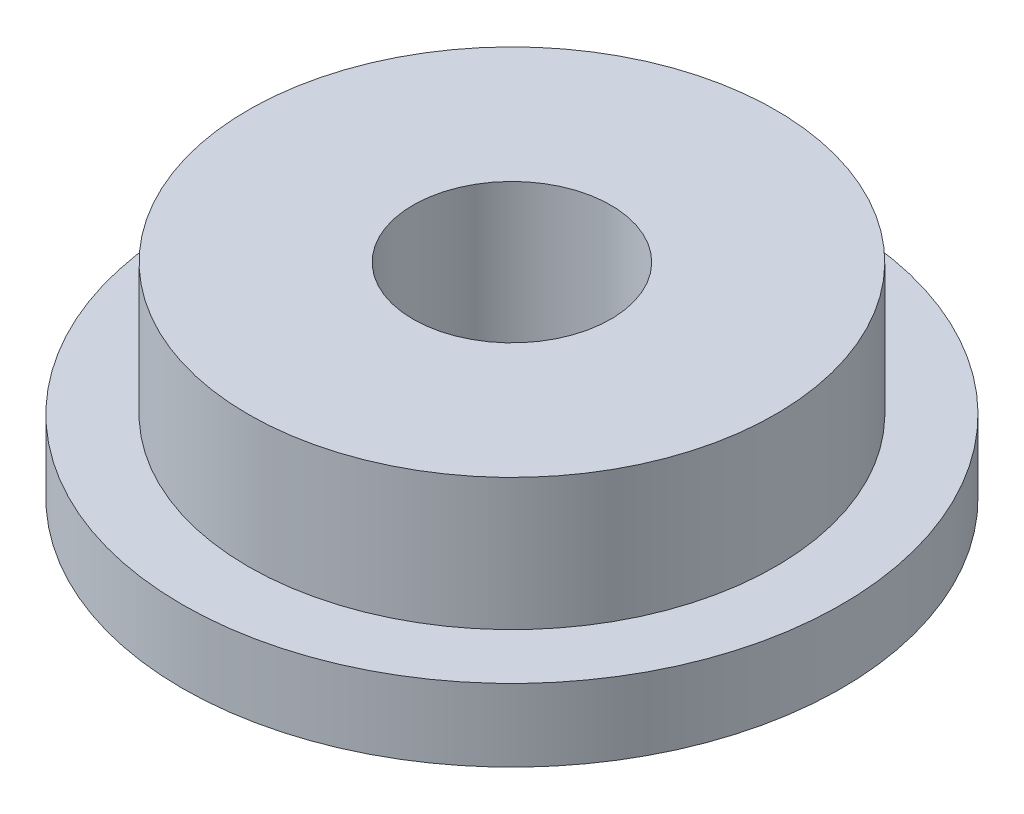
ISO-10303-21;
HEADER;
FILE_DESCRIPTION(('STEP AP214'),'2;1');
FILE_NAME('part.step','',(''),(''),'','','');
FILE_SCHEMA(('AUTOMOTIVE_DESIGN { 1 0 10303 214 1 1 1 1 }'));
ENDSEC;
DATA;
#1=APPLICATION_CONTEXT('core data for automotive mechanical design processes');
#2=APPLICATION_PROTOCOL_DEFINITION('international standard','automotive_design',2000,#1);
#3=PRODUCT_CONTEXT('',#1,'mechanical');
#4=PRODUCT('Part','Part','',(#3));
#5=PRODUCT_RELATED_PRODUCT_CATEGORY('part','',(#4));
#6=PRODUCT_DEFINITION_FORMATION('','',#4);
#7=PRODUCT_DEFINITION_CONTEXT('part definition',#1,'design');
#8=PRODUCT_DEFINITION('design','',#6,#7);
#9=PRODUCT_DEFINITION_SHAPE('','',#8);
#10=(LENGTH_UNIT() NAMED_UNIT(*) SI_UNIT(.MILLI.,.METRE.));
#11=(NAMED_UNIT(*) PLANE_ANGLE_UNIT() SI_UNIT($,.RADIAN.));
#12=(NAMED_UNIT(*) SI_UNIT($,.STERADIAN.) SOLID_ANGLE_UNIT());
#13=UNCERTAINTY_MEASURE_WITH_UNIT(LENGTH_MEASURE(1.E-05),#10,'distance_accuracy_value','');
#14=(GEOMETRIC_REPRESENTATION_CONTEXT(3) GLOBAL_UNCERTAINTY_ASSIGNED_CONTEXT((#13)) GLOBAL_UNIT_ASSIGNED_CONTEXT((#10,
#11,#12)) REPRESENTATION_CONTEXT('',''));
#15=CARTESIAN_POINT('',(0.,0.,0.));
#16=DIRECTION('',(0.,0.,1.));
#17=DIRECTION('',(1.,0.,0.));
#18=AXIS2_PLACEMENT_3D('',#15,#16,#17);
#19=CARTESIAN_POINT('',(0.,1.1,0.));
#20=DIRECTION('',(0.,-1.,0.));
#21=DIRECTION('',(0.,0.,-1.));
#22=AXIS2_PLACEMENT_3D('',#19,#20,#21);
#23=CYLINDRICAL_SURFACE('',#22,5.);
#24=CARTESIAN_POINT('',(0.,1.1,0.));
#25=DIRECTION('',(0.,1.,0.));
#26=DIRECTION('',(0.,0.,1.));
#27=AXIS2_PLACEMENT_3D('',#24,#25,#26);
#28=CIRCLE('',#27,5.);
#29=CARTESIAN_POINT('',(0.,1.1,5.));
#30=VERTEX_POINT('',#29);
#31=EDGE_CURVE('E45',#30,#30,#28,.T.);
#32=ORIENTED_EDGE('',*,*,#31,.F.);
#33=EDGE_LOOP('',(#32));
#34=FACE_BOUND('',#33,.T.);
#35=CARTESIAN_POINT('',(0.,0.,0.));
#36=DIRECTION('',(0.,1.,0.));
#37=DIRECTION('',(0.,0.,1.));
#38=AXIS2_PLACEMENT_3D('',#35,#36,#37);
#39=CIRCLE('',#38,5.);
#40=CARTESIAN_POINT('',(0.,0.,5.));
#41=VERTEX_POINT('',#40);
#42=EDGE_CURVE('E40',#41,#41,#39,.T.);
#43=ORIENTED_EDGE('',*,*,#42,.T.);
#44=EDGE_LOOP('',(#43));
#45=FACE_BOUND('',#44,.T.);
#46=ADVANCED_FACE('F37',(#34,#45),#23,.T.);
#47=CARTESIAN_POINT('',(0.,1.1,0.));
#48=DIRECTION('',(0.,1.,0.));
#49=DIRECTION('',(0.,0.,1.));
#50=AXIS2_PLACEMENT_3D('',#47,#48,#49);
#51=PLANE('',#50);
#52=CARTESIAN_POINT('',(0.,1.1,0.));
#53=DIRECTION('',(0.,1.,0.));
#54=DIRECTION('',(0.,0.,1.));
#55=AXIS2_PLACEMENT_3D('',#52,#53,#54);
#56=CIRCLE('',#55,4.);
#57=CARTESIAN_POINT('',(0.,1.1,4.));
#58=VERTEX_POINT('',#57);
#59=EDGE_CURVE('E10',#58,#58,#56,.T.);
#60=ORIENTED_EDGE('',*,*,#59,.F.);
#61=EDGE_LOOP('',(#60));
#62=FACE_BOUND('',#61,.T.);
#63=ORIENTED_EDGE('',*,*,#31,.T.);
#64=EDGE_LOOP('',(#63));
#65=FACE_BOUND('',#64,.T.);
#66=ADVANCED_FACE('F86',(#62,#65),#51,.T.);
#67=CARTESIAN_POINT('',(0.,0.,0.));
#68=DIRECTION('',(0.,1.,0.));
#69=DIRECTION('',(0.,0.,1.));
#70=AXIS2_PLACEMENT_3D('',#67,#68,#69);
#71=PLANE('',#70);
#72=CARTESIAN_POINT('',(0.,0.,0.));
#73=DIRECTION('',(0.,1.,0.));
#74=DIRECTION('',(0.,0.,1.));
#75=AXIS2_PLACEMENT_3D('',#72,#73,#74);
#76=CIRCLE('',#75,1.5);
#77=CARTESIAN_POINT('',(0.,0.,1.5));
#78=VERTEX_POINT('',#77);
#79=EDGE_CURVE('E56',#78,#78,#76,.T.);
#80=ORIENTED_EDGE('',*,*,#79,.T.);
#81=EDGE_LOOP('',(#80));
#82=FACE_BOUND('',#81,.T.);
#83=ORIENTED_EDGE('',*,*,#42,.F.);
#84=EDGE_LOOP('',(#83));
#85=FACE_BOUND('',#84,.T.);
#86=ADVANCED_FACE('F65',(#82,#85),#71,.F.);
#87=CARTESIAN_POINT('',(0.,3.1,0.));
#88=DIRECTION('',(0.,-1.,0.));
#89=DIRECTION('',(0.,0.,-1.));
#90=AXIS2_PLACEMENT_3D('',#87,#88,#89);
#91=CYLINDRICAL_SURFACE('',#90,4.);
#92=CARTESIAN_POINT('',(0.,3.1,0.));
#93=DIRECTION('',(0.,1.,0.));
#94=DIRECTION('',(0.,0.,1.));
#95=AXIS2_PLACEMENT_3D('',#92,#93,#94);
#96=CIRCLE('',#95,4.);
#97=CARTESIAN_POINT('',(0.,3.1,4.));
#98=VERTEX_POINT('',#97);
#99=EDGE_CURVE('E52',#98,#98,#96,.T.);
#100=ORIENTED_EDGE('',*,*,#99,.F.);
#101=EDGE_LOOP('',(#100));
#102=FACE_BOUND('',#101,.T.);
#103=ORIENTED_EDGE('',*,*,#59,.T.);
#104=EDGE_LOOP('',(#103));
#105=FACE_BOUND('',#104,.T.);
#106=ADVANCED_FACE('F77',(#102,#105),#91,.T.);
#107=CARTESIAN_POINT('',(0.,3.1,0.));
#108=DIRECTION('',(0.,1.,0.));
#109=DIRECTION('',(0.,0.,1.));
#110=AXIS2_PLACEMENT_3D('',#107,#108,#109);
#111=PLANE('',#110);
#112=CARTESIAN_POINT('',(0.,3.1,0.));
#113=DIRECTION('',(0.,1.,0.));
#114=DIRECTION('',(0.,0.,1.));
#115=AXIS2_PLACEMENT_3D('',#112,#113,#114);
#116=CIRCLE('',#115,1.5);
#117=CARTESIAN_POINT('',(0.,3.1,1.5));
#118=VERTEX_POINT('',#117);
#119=EDGE_CURVE('E57',#118,#118,#116,.T.);
#120=ORIENTED_EDGE('',*,*,#119,.F.);
#121=EDGE_LOOP('',(#120));
#122=FACE_BOUND('',#121,.T.);
#123=ORIENTED_EDGE('',*,*,#99,.T.);
#124=EDGE_LOOP('',(#123));
#125=FACE_BOUND('',#124,.T.);
#126=ADVANCED_FACE('F71',(#122,#125),#111,.T.);
#127=CARTESIAN_POINT('',(0.,0.,0.));
#128=DIRECTION('',(0.,1.,0.));
#129=DIRECTION('',(0.,0.,1.));
#130=AXIS2_PLACEMENT_3D('',#127,#128,#129);
#131=CYLINDRICAL_SURFACE('',#130,1.5);
#132=ORIENTED_EDGE('',*,*,#79,.F.);
#133=EDGE_LOOP('',(#132));
#134=FACE_BOUND('',#133,.T.);
#135=ORIENTED_EDGE('',*,*,#119,.T.);
#136=EDGE_LOOP('',(#135));
#137=FACE_BOUND('',#136,.T.);
#138=ADVANCED_FACE('F68',(#134,#137),#131,.F.);
#139=CLOSED_SHELL('',(#46,#66,#86,#106,#126,#138));
#140=MANIFOLD_SOLID_BREP('B2',#139);
#141=ADVANCED_BREP_SHAPE_REPRESENTATION('',(#18,#140),#14);
#142=SHAPE_DEFINITION_REPRESENTATION(#9,#141);
ENDSEC;
END-ISO-10303-21;
